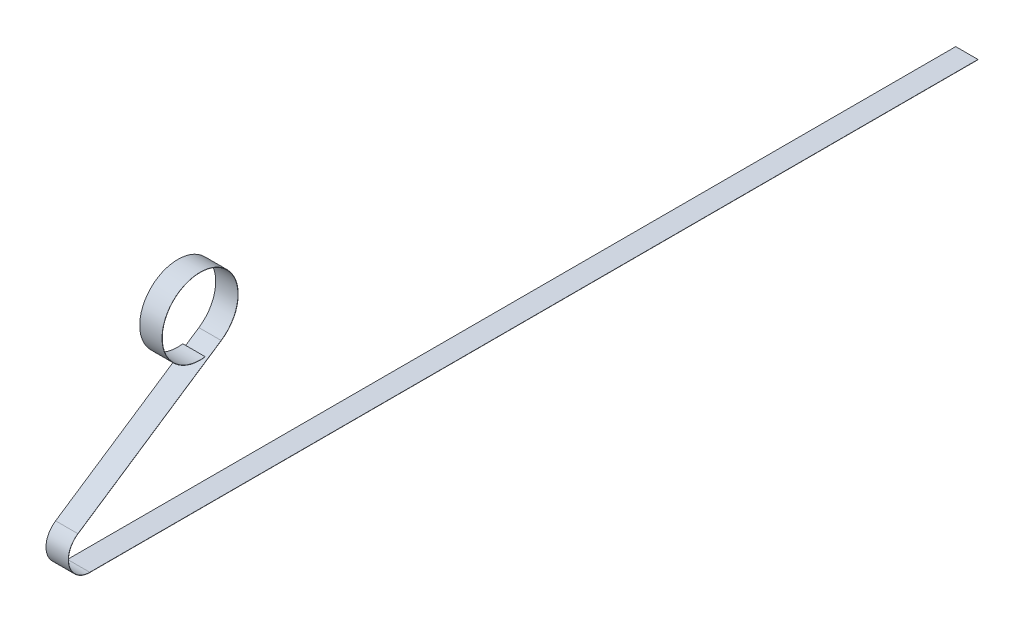
ISO-10303-21;
HEADER;
FILE_DESCRIPTION(('STEP AP214'),'2;1');
FILE_NAME('part.step','',(''),(''),'','','');
FILE_SCHEMA(('AUTOMOTIVE_DESIGN { 1 0 10303 214 1 1 1 1 }'));
ENDSEC;
DATA;
#1=APPLICATION_CONTEXT('core data for automotive mechanical design processes');
#2=APPLICATION_PROTOCOL_DEFINITION('international standard','automotive_design',2000,#1);
#3=PRODUCT_CONTEXT('',#1,'mechanical');
#4=PRODUCT('Part','Part','',(#3));
#5=PRODUCT_RELATED_PRODUCT_CATEGORY('part','',(#4));
#6=PRODUCT_DEFINITION_FORMATION('','',#4);
#7=PRODUCT_DEFINITION_CONTEXT('part definition',#1,'design');
#8=PRODUCT_DEFINITION('design','',#6,#7);
#9=PRODUCT_DEFINITION_SHAPE('','',#8);
#10=(LENGTH_UNIT() NAMED_UNIT(*) SI_UNIT(.MILLI.,.METRE.));
#11=(NAMED_UNIT(*) PLANE_ANGLE_UNIT() SI_UNIT($,.RADIAN.));
#12=(NAMED_UNIT(*) SI_UNIT($,.STERADIAN.) SOLID_ANGLE_UNIT());
#13=UNCERTAINTY_MEASURE_WITH_UNIT(LENGTH_MEASURE(1.E-05),#10,'distance_accuracy_value','');
#14=(GEOMETRIC_REPRESENTATION_CONTEXT(3) GLOBAL_UNCERTAINTY_ASSIGNED_CONTEXT((#13)) GLOBAL_UNIT_ASSIGNED_CONTEXT((#10,
#11,#12)) REPRESENTATION_CONTEXT('',''));
#15=CARTESIAN_POINT('',(0.,0.,0.));
#16=DIRECTION('',(0.,0.,1.));
#17=DIRECTION('',(1.,0.,0.));
#18=AXIS2_PLACEMENT_3D('',#15,#16,#17);
#19=CARTESIAN_POINT('',(0.,0.,1012.444));
#20=DIRECTION('',(-1.,0.,0.));
#21=DIRECTION('',(0.,0.,1.));
#22=AXIS2_PLACEMENT_3D('',#19,#20,#21);
#23=PLANE('',#22);
#24=DIRECTION('',(0.,1.,0.));
#25=VECTOR('',#24,1.);
#26=CARTESIAN_POINT('',(0.,0.,0.));
#27=LINE('',#26,#25);
#28=CARTESIAN_POINT('',(0.,0.,0.));
#29=VERTEX_POINT('',#28);
#30=CARTESIAN_POINT('',(0.,0.254,0.));
#31=VERTEX_POINT('',#30);
#32=EDGE_CURVE('E96',#29,#31,#27,.T.);
#33=ORIENTED_EDGE('',*,*,#32,.F.);
#34=DIRECTION('',(0.,0.,-1.));
#35=VECTOR('',#34,1.);
#36=CARTESIAN_POINT('',(0.,0.,1012.444));
#37=LINE('',#36,#35);
#38=CARTESIAN_POINT('',(0.,0.,1012.444));
#39=VERTEX_POINT('',#38);
#40=EDGE_CURVE('E11',#39,#29,#37,.T.);
#41=ORIENTED_EDGE('',*,*,#40,.F.);
#42=CARTESIAN_POINT('',(0.,24.6376497885547,1012.31331339351));
#43=DIRECTION('',(1.,0.,0.));
#44=DIRECTION('',(0.,0.,-1.));
#45=AXIS2_PLACEMENT_3D('',#42,#43,#44);
#46=CIRCLE('',#45,24.6379963895725);
#47=CARTESIAN_POINT('',(0.,45.124387485329,1025.99996545442));
#48=VERTEX_POINT('',#47);
#49=EDGE_CURVE('E158',#48,#39,#46,.T.);
#50=ORIENTED_EDGE('',*,*,#49,.F.);
#51=DIRECTION('',(0.,0.555464002573656,-0.831540583402189));
#52=VECTOR('',#51,1.);
#53=CARTESIAN_POINT('',(0.,45.124387485329,1025.99996545442));
#54=LINE('',#53,#52);
#55=CARTESIAN_POINT('',(0.,154.213526749913,862.691369241854));
#56=VERTEX_POINT('',#55);
#57=EDGE_CURVE('E137',#48,#56,#54,.T.);
#58=ORIENTED_EDGE('',*,*,#57,.T.);
#59=CARTESIAN_POINT('',(0.,190.120208338308,886.675174907493));
#60=DIRECTION('',(1.,0.,0.));
#61=DIRECTION('',(0.,0.,-1.));
#62=AXIS2_PLACEMENT_3D('',#59,#60,#61);
#63=CIRCLE('',#62,43.1800036694947);
#64=CARTESIAN_POINT('',(0.,147.323760438018,880.932635049961));
#65=VERTEX_POINT('',#64);
#66=EDGE_CURVE('E110',#56,#65,#63,.T.);
#67=ORIENTED_EDGE('',*,*,#66,.T.);
#68=DIRECTION('',(0.,0.990385920383358,0.138331951140757));
#69=VECTOR('',#68,1.);
#70=CARTESIAN_POINT('',(0.,147.323760438018,880.932635049961));
#71=LINE('',#70,#69);
#72=CARTESIAN_POINT('',(0.,147.072202414241,880.897498734372));
#73=VERTEX_POINT('',#72);
#74=EDGE_CURVE('E134',#73,#65,#71,.T.);
#75=ORIENTED_EDGE('',*,*,#74,.F.);
#76=CARTESIAN_POINT('',(0.,190.120208338308,886.675174907493));
#77=DIRECTION('',(1.,0.,0.));
#78=DIRECTION('',(0.,0.,-1.));
#79=AXIS2_PLACEMENT_3D('',#76,#77,#78);
#80=CIRCLE('',#79,43.4339999999999);
#81=CARTESIAN_POINT('',(0.,154.003074638818,862.549151419709));
#82=VERTEX_POINT('',#81);
#83=EDGE_CURVE('E122',#82,#73,#80,.T.);
#84=ORIENTED_EDGE('',*,*,#83,.F.);
#85=DIRECTION('',(0.,0.555464002573656,-0.831540583402189));
#86=VECTOR('',#85,1.);
#87=CARTESIAN_POINT('',(0.,44.9139353742339,1025.85774763227));
#88=LINE('',#87,#86);
#89=CARTESIAN_POINT('',(0.,44.9139353742339,1025.85774763227));
#90=VERTEX_POINT('',#89);
#91=EDGE_CURVE('E145',#90,#82,#88,.T.);
#92=ORIENTED_EDGE('',*,*,#91,.F.);
#93=CARTESIAN_POINT('',(0.,24.6376497885547,1012.31331339351));
#94=DIRECTION('',(1.,0.,0.));
#95=DIRECTION('',(0.,0.,-1.));
#96=AXIS2_PLACEMENT_3D('',#93,#94,#95);
#97=CIRCLE('',#96,24.3840000000001);
#98=CARTESIAN_POINT('',(0.,0.254,1012.444));
#99=VERTEX_POINT('',#98);
#100=EDGE_CURVE('E154',#90,#99,#97,.T.);
#101=ORIENTED_EDGE('',*,*,#100,.T.);
#102=DIRECTION('',(0.,0.,-1.));
#103=VECTOR('',#102,1.);
#104=CARTESIAN_POINT('',(0.,0.254,1012.444));
#105=LINE('',#104,#103);
#106=EDGE_CURVE('E38',#99,#31,#105,.T.);
#107=ORIENTED_EDGE('',*,*,#106,.T.);
#108=EDGE_LOOP('',(#33,#41,#50,#58,#67,#75,#84,#92,#101,#107));
#109=FACE_BOUND('',#108,.T.);
#110=ADVANCED_FACE('F35',(#109),#23,.T.);
#111=CARTESIAN_POINT('',(0.,0.,1012.444));
#112=DIRECTION('',(0.,1.,0.));
#113=DIRECTION('',(0.,0.,1.));
#114=AXIS2_PLACEMENT_3D('',#111,#112,#113);
#115=PLANE('',#114);
#116=DIRECTION('',(1.,0.,0.));
#117=VECTOR('',#116,1.);
#118=CARTESIAN_POINT('',(0.,0.,0.));
#119=LINE('',#118,#117);
#120=CARTESIAN_POINT('',(25.4,0.,0.));
#121=VERTEX_POINT('',#120);
#122=EDGE_CURVE('E68',#29,#121,#119,.T.);
#123=ORIENTED_EDGE('',*,*,#122,.T.);
#124=DIRECTION('',(0.,0.,-1.));
#125=VECTOR('',#124,1.);
#126=CARTESIAN_POINT('',(25.4,0.,1012.444));
#127=LINE('',#126,#125);
#128=CARTESIAN_POINT('',(25.4,0.,1012.444));
#129=VERTEX_POINT('',#128);
#130=EDGE_CURVE('E44',#129,#121,#127,.T.);
#131=ORIENTED_EDGE('',*,*,#130,.F.);
#132=DIRECTION('',(1.,0.,0.));
#133=VECTOR('',#132,1.);
#134=CARTESIAN_POINT('',(0.,0.,1012.444));
#135=LINE('',#134,#133);
#136=EDGE_CURVE('E101',#39,#129,#135,.T.);
#137=ORIENTED_EDGE('',*,*,#136,.F.);
#138=ORIENTED_EDGE('',*,*,#40,.T.);
#139=EDGE_LOOP('',(#123,#131,#137,#138));
#140=FACE_BOUND('',#139,.T.);
#141=ADVANCED_FACE('F70',(#140),#115,.F.);
#142=CARTESIAN_POINT('',(25.4,0.,1012.444));
#143=DIRECTION('',(-1.,0.,0.));
#144=DIRECTION('',(0.,0.,1.));
#145=AXIS2_PLACEMENT_3D('',#142,#143,#144);
#146=PLANE('',#145);
#147=DIRECTION('',(0.,1.,0.));
#148=VECTOR('',#147,1.);
#149=CARTESIAN_POINT('',(25.4,0.,0.));
#150=LINE('',#149,#148);
#151=CARTESIAN_POINT('',(25.4,0.254,0.));
#152=VERTEX_POINT('',#151);
#153=EDGE_CURVE('E79',#121,#152,#150,.T.);
#154=ORIENTED_EDGE('',*,*,#153,.T.);
#155=DIRECTION('',(0.,0.,-1.));
#156=VECTOR('',#155,1.);
#157=CARTESIAN_POINT('',(25.4,0.254,1012.444));
#158=LINE('',#157,#156);
#159=CARTESIAN_POINT('',(25.4,0.254,1012.444));
#160=VERTEX_POINT('',#159);
#161=EDGE_CURVE('E90',#160,#152,#158,.T.);
#162=ORIENTED_EDGE('',*,*,#161,.F.);
#163=CARTESIAN_POINT('',(25.4,24.6376497885547,1012.31331339351));
#164=DIRECTION('',(1.,0.,0.));
#165=DIRECTION('',(0.,0.,-1.));
#166=AXIS2_PLACEMENT_3D('',#163,#164,#165);
#167=CIRCLE('',#166,24.3840000000001);
#168=CARTESIAN_POINT('',(25.4,44.9139353742339,1025.85774763227));
#169=VERTEX_POINT('',#168);
#170=EDGE_CURVE('E52',#169,#160,#167,.T.);
#171=ORIENTED_EDGE('',*,*,#170,.F.);
#172=DIRECTION('',(0.,0.555464002573656,-0.831540583402189));
#173=VECTOR('',#172,1.);
#174=CARTESIAN_POINT('',(25.4,44.9139353742339,1025.85774763227));
#175=LINE('',#174,#173);
#176=CARTESIAN_POINT('',(25.4,154.003074638818,862.549151419709));
#177=VERTEX_POINT('',#176);
#178=EDGE_CURVE('E142',#169,#177,#175,.T.);
#179=ORIENTED_EDGE('',*,*,#178,.T.);
#180=CARTESIAN_POINT('',(25.4,190.120208338308,886.675174907493));
#181=DIRECTION('',(1.,0.,0.));
#182=DIRECTION('',(0.,0.,-1.));
#183=AXIS2_PLACEMENT_3D('',#180,#181,#182);
#184=CIRCLE('',#183,43.4339999999999);
#185=CARTESIAN_POINT('',(25.4,147.072202414241,880.897498734372));
#186=VERTEX_POINT('',#185);
#187=EDGE_CURVE('E117',#177,#186,#184,.T.);
#188=ORIENTED_EDGE('',*,*,#187,.T.);
#189=DIRECTION('',(0.,-0.990385920383358,-0.138331951140757));
#190=VECTOR('',#189,1.);
#191=CARTESIAN_POINT('',(25.4,147.323760438018,880.932635049961));
#192=LINE('',#191,#190);
#193=CARTESIAN_POINT('',(25.4,147.323760438018,880.932635049961));
#194=VERTEX_POINT('',#193);
#195=EDGE_CURVE('E128',#194,#186,#192,.T.);
#196=ORIENTED_EDGE('',*,*,#195,.F.);
#197=CARTESIAN_POINT('',(25.4,190.120208338308,886.675174907493));
#198=DIRECTION('',(1.,0.,0.));
#199=DIRECTION('',(0.,0.,-1.));
#200=AXIS2_PLACEMENT_3D('',#197,#198,#199);
#201=CIRCLE('',#200,43.1800036694947);
#202=CARTESIAN_POINT('',(25.4,154.213526749913,862.691369241854));
#203=VERTEX_POINT('',#202);
#204=EDGE_CURVE('E112',#203,#194,#201,.T.);
#205=ORIENTED_EDGE('',*,*,#204,.F.);
#206=DIRECTION('',(0.,0.555464002573656,-0.831540583402189));
#207=VECTOR('',#206,1.);
#208=CARTESIAN_POINT('',(25.4,45.124387485329,1025.99996545442));
#209=LINE('',#208,#207);
#210=CARTESIAN_POINT('',(25.4,45.124387485329,1025.99996545442));
#211=VERTEX_POINT('',#210);
#212=EDGE_CURVE('E139',#211,#203,#209,.T.);
#213=ORIENTED_EDGE('',*,*,#212,.F.);
#214=CARTESIAN_POINT('',(25.4,24.6376497885547,1012.31331339351));
#215=DIRECTION('',(1.,0.,0.));
#216=DIRECTION('',(0.,0.,-1.));
#217=AXIS2_PLACEMENT_3D('',#214,#215,#216);
#218=CIRCLE('',#217,24.6379963895725);
#219=EDGE_CURVE('E88',#211,#129,#218,.T.);
#220=ORIENTED_EDGE('',*,*,#219,.T.);
#221=ORIENTED_EDGE('',*,*,#130,.T.);
#222=EDGE_LOOP('',(#154,#162,#171,#179,#188,#196,#205,#213,#220,#221));
#223=FACE_BOUND('',#222,.T.);
#224=ADVANCED_FACE('F84',(#223),#146,.F.);
#225=CARTESIAN_POINT('',(0.,0.254,1012.444));
#226=DIRECTION('',(0.,1.,0.));
#227=DIRECTION('',(0.,0.,1.));
#228=AXIS2_PLACEMENT_3D('',#225,#226,#227);
#229=PLANE('',#228);
#230=DIRECTION('',(1.,0.,0.));
#231=VECTOR('',#230,1.);
#232=CARTESIAN_POINT('',(0.,0.254,0.));
#233=LINE('',#232,#231);
#234=EDGE_CURVE('E94',#31,#152,#233,.T.);
#235=ORIENTED_EDGE('',*,*,#234,.F.);
#236=ORIENTED_EDGE('',*,*,#106,.F.);
#237=DIRECTION('',(1.,0.,0.));
#238=VECTOR('',#237,1.);
#239=CARTESIAN_POINT('',(0.,0.254,1012.444));
#240=LINE('',#239,#238);
#241=EDGE_CURVE('E78',#99,#160,#240,.T.);
#242=ORIENTED_EDGE('',*,*,#241,.T.);
#243=ORIENTED_EDGE('',*,*,#161,.T.);
#244=EDGE_LOOP('',(#235,#236,#242,#243));
#245=FACE_BOUND('',#244,.T.);
#246=ADVANCED_FACE('F230',(#245),#229,.T.);
#247=CARTESIAN_POINT('',(0.,0.,0.));
#248=DIRECTION('',(0.,0.,-1.));
#249=DIRECTION('',(-1.,0.,0.));
#250=AXIS2_PLACEMENT_3D('',#247,#248,#249);
#251=PLANE('',#250);
#252=ORIENTED_EDGE('',*,*,#32,.T.);
#253=ORIENTED_EDGE('',*,*,#234,.T.);
#254=ORIENTED_EDGE('',*,*,#153,.F.);
#255=ORIENTED_EDGE('',*,*,#122,.F.);
#256=EDGE_LOOP('',(#252,#253,#254,#255));
#257=FACE_BOUND('',#256,.T.);
#258=ADVANCED_FACE('F92',(#257),#251,.T.);
#259=CARTESIAN_POINT('',(0.,190.120208338308,886.675174907493));
#260=DIRECTION('',(1.,0.,0.));
#261=DIRECTION('',(0.,0.,-1.));
#262=AXIS2_PLACEMENT_3D('',#259,#260,#261);
#263=CYLINDRICAL_SURFACE('',#262,43.1800036694947);
#264=DIRECTION('',(1.,0.,0.));
#265=VECTOR('',#264,1.);
#266=CARTESIAN_POINT('',(0.,154.213526749913,862.691369241854));
#267=LINE('',#266,#265);
#268=EDGE_CURVE('E148',#56,#203,#267,.T.);
#269=ORIENTED_EDGE('',*,*,#268,.T.);
#270=ORIENTED_EDGE('',*,*,#204,.T.);
#271=DIRECTION('',(1.,0.,0.));
#272=VECTOR('',#271,1.);
#273=CARTESIAN_POINT('',(0.,147.323760438018,880.932635049961));
#274=LINE('',#273,#272);
#275=EDGE_CURVE('E125',#65,#194,#274,.T.);
#276=ORIENTED_EDGE('',*,*,#275,.F.);
#277=ORIENTED_EDGE('',*,*,#66,.F.);
#278=EDGE_LOOP('',(#269,#270,#276,#277));
#279=FACE_BOUND('',#278,.T.);
#280=ADVANCED_FACE('F224',(#279),#263,.F.);
#281=CARTESIAN_POINT('',(0.,190.120208338308,886.675174907493));
#282=DIRECTION('',(1.,0.,0.));
#283=DIRECTION('',(0.,0.,-1.));
#284=AXIS2_PLACEMENT_3D('',#281,#282,#283);
#285=CYLINDRICAL_SURFACE('',#284,43.4339999999999);
#286=DIRECTION('',(-1.,0.,0.));
#287=VECTOR('',#286,1.);
#288=CARTESIAN_POINT('',(0.,154.003074638818,862.549151419709));
#289=LINE('',#288,#287);
#290=EDGE_CURVE('E151',#177,#82,#289,.T.);
#291=ORIENTED_EDGE('',*,*,#290,.T.);
#292=ORIENTED_EDGE('',*,*,#83,.T.);
#293=DIRECTION('',(-1.,0.,0.));
#294=VECTOR('',#293,1.);
#295=CARTESIAN_POINT('',(0.,147.072202414241,880.897498734372));
#296=LINE('',#295,#294);
#297=EDGE_CURVE('E131',#186,#73,#296,.T.);
#298=ORIENTED_EDGE('',*,*,#297,.F.);
#299=ORIENTED_EDGE('',*,*,#187,.F.);
#300=EDGE_LOOP('',(#291,#292,#298,#299));
#301=FACE_BOUND('',#300,.T.);
#302=ADVANCED_FACE('F227',(#301),#285,.T.);
#303=CARTESIAN_POINT('',(0.,45.124387485329,1025.99996545442));
#304=DIRECTION('',(0.,0.831540583402189,0.555464002573656));
#305=DIRECTION('',(0.,-0.555464002573656,0.83154058340219));
#306=AXIS2_PLACEMENT_3D('',#303,#304,#305);
#307=PLANE('',#306);
#308=DIRECTION('',(1.,0.,0.));
#309=VECTOR('',#308,1.);
#310=CARTESIAN_POINT('',(0.,45.124387485329,1025.99996545442));
#311=LINE('',#310,#309);
#312=EDGE_CURVE('E163',#48,#211,#311,.T.);
#313=ORIENTED_EDGE('',*,*,#312,.T.);
#314=ORIENTED_EDGE('',*,*,#212,.T.);
#315=ORIENTED_EDGE('',*,*,#268,.F.);
#316=ORIENTED_EDGE('',*,*,#57,.F.);
#317=EDGE_LOOP('',(#313,#314,#315,#316));
#318=FACE_BOUND('',#317,.T.);
#319=ADVANCED_FACE('F169',(#318),#307,.T.);
#320=CARTESIAN_POINT('',(0.,44.9139353742339,1025.85774763227));
#321=DIRECTION('',(0.,-0.831540583402189,-0.555464002573656));
#322=DIRECTION('',(0.,0.555464002573656,-0.83154058340219));
#323=AXIS2_PLACEMENT_3D('',#320,#321,#322);
#324=PLANE('',#323);
#325=DIRECTION('',(-1.,0.,0.));
#326=VECTOR('',#325,1.);
#327=CARTESIAN_POINT('',(0.,44.9139353742339,1025.85774763227));
#328=LINE('',#327,#326);
#329=EDGE_CURVE('E160',#169,#90,#328,.T.);
#330=ORIENTED_EDGE('',*,*,#329,.T.);
#331=ORIENTED_EDGE('',*,*,#91,.T.);
#332=ORIENTED_EDGE('',*,*,#290,.F.);
#333=ORIENTED_EDGE('',*,*,#178,.F.);
#334=EDGE_LOOP('',(#330,#331,#332,#333));
#335=FACE_BOUND('',#334,.T.);
#336=ADVANCED_FACE('F187',(#335),#324,.T.);
#337=CARTESIAN_POINT('',(0.,24.6376497885547,1012.31331339351));
#338=DIRECTION('',(1.,0.,0.));
#339=DIRECTION('',(0.,0.,-1.));
#340=AXIS2_PLACEMENT_3D('',#337,#338,#339);
#341=CYLINDRICAL_SURFACE('',#340,24.3840000000001);
#342=ORIENTED_EDGE('',*,*,#170,.T.);
#343=ORIENTED_EDGE('',*,*,#241,.F.);
#344=ORIENTED_EDGE('',*,*,#100,.F.);
#345=ORIENTED_EDGE('',*,*,#329,.F.);
#346=EDGE_LOOP('',(#342,#343,#344,#345));
#347=FACE_BOUND('',#346,.T.);
#348=ADVANCED_FACE('F179',(#347),#341,.F.);
#349=CARTESIAN_POINT('',(0.,24.6376497885547,1012.31331339351));
#350=DIRECTION('',(1.,0.,0.));
#351=DIRECTION('',(0.,0.,-1.));
#352=AXIS2_PLACEMENT_3D('',#349,#350,#351);
#353=CYLINDRICAL_SURFACE('',#352,24.6379963895725);
#354=ORIENTED_EDGE('',*,*,#312,.F.);
#355=ORIENTED_EDGE('',*,*,#49,.T.);
#356=ORIENTED_EDGE('',*,*,#136,.T.);
#357=ORIENTED_EDGE('',*,*,#219,.F.);
#358=EDGE_LOOP('',(#354,#355,#356,#357));
#359=FACE_BOUND('',#358,.T.);
#360=ADVANCED_FACE('F176',(#359),#353,.T.);
#361=CARTESIAN_POINT('',(0.,147.323760438018,880.932635049961));
#362=DIRECTION('',(0.,-0.138331951140757,0.990385920383358));
#363=DIRECTION('',(-1.,0.,0.));
#364=AXIS2_PLACEMENT_3D('',#361,#362,#363);
#365=PLANE('',#364);
#366=ORIENTED_EDGE('',*,*,#74,.T.);
#367=ORIENTED_EDGE('',*,*,#275,.T.);
#368=ORIENTED_EDGE('',*,*,#195,.T.);
#369=ORIENTED_EDGE('',*,*,#297,.T.);
#370=EDGE_LOOP('',(#366,#367,#368,#369));
#371=FACE_BOUND('',#370,.T.);
#372=ADVANCED_FACE('F178',(#371),#365,.F.);
#373=CLOSED_SHELL('',(#110,#141,#224,#246,#258,#280,#302,#319,#336,#348,#360,#372));
#374=MANIFOLD_SOLID_BREP('B2',#373);
#375=ADVANCED_BREP_SHAPE_REPRESENTATION('',(#18,#374),#14);
#376=SHAPE_DEFINITION_REPRESENTATION(#9,#375);
ENDSEC;
END-ISO-10303-21;
